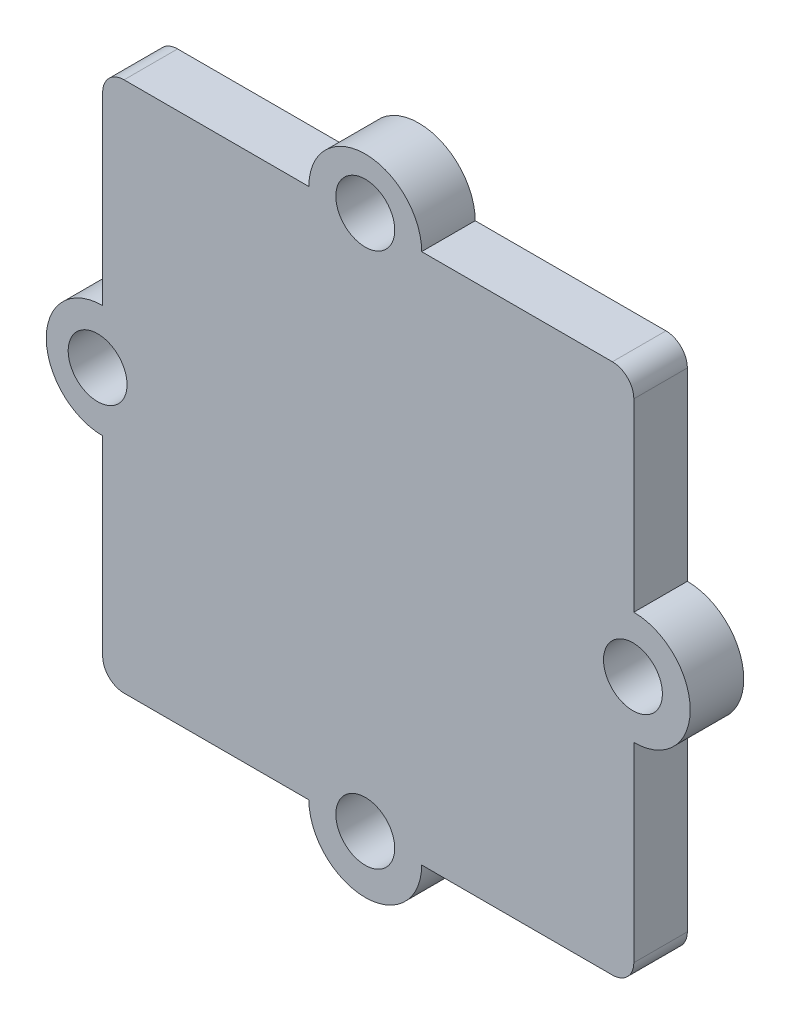
ISO-10303-21;
HEADER;
FILE_DESCRIPTION(('STEP AP214'),'2;1');
FILE_NAME('part.step','',(''),(''),'','','');
FILE_SCHEMA(('AUTOMOTIVE_DESIGN { 1 0 10303 214 1 1 1 1 }'));
ENDSEC;
DATA;
#1=APPLICATION_CONTEXT('core data for automotive mechanical design processes');
#2=APPLICATION_PROTOCOL_DEFINITION('international standard','automotive_design',2000,#1);
#3=PRODUCT_CONTEXT('',#1,'mechanical');
#4=PRODUCT('Part','Part','',(#3));
#5=PRODUCT_RELATED_PRODUCT_CATEGORY('part','',(#4));
#6=PRODUCT_DEFINITION_FORMATION('','',#4);
#7=PRODUCT_DEFINITION_CONTEXT('part definition',#1,'design');
#8=PRODUCT_DEFINITION('design','',#6,#7);
#9=PRODUCT_DEFINITION_SHAPE('','',#8);
#10=(LENGTH_UNIT() NAMED_UNIT(*) SI_UNIT(.MILLI.,.METRE.));
#11=(NAMED_UNIT(*) PLANE_ANGLE_UNIT() SI_UNIT($,.RADIAN.));
#12=(NAMED_UNIT(*) SI_UNIT($,.STERADIAN.) SOLID_ANGLE_UNIT());
#13=UNCERTAINTY_MEASURE_WITH_UNIT(LENGTH_MEASURE(1.E-05),#10,'distance_accuracy_value','');
#14=(GEOMETRIC_REPRESENTATION_CONTEXT(3) GLOBAL_UNCERTAINTY_ASSIGNED_CONTEXT((#13)) GLOBAL_UNIT_ASSIGNED_CONTEXT((#10,
#11,#12)) REPRESENTATION_CONTEXT('',''));
#15=CARTESIAN_POINT('',(0.,0.,0.));
#16=DIRECTION('',(0.,0.,1.));
#17=DIRECTION('',(1.,0.,0.));
#18=AXIS2_PLACEMENT_3D('',#15,#16,#17);
#19=CARTESIAN_POINT('',(-0.189992290307353,8.90032618677888,0.));
#20=DIRECTION('',(0.,0.,-1.));
#21=DIRECTION('',(-1.,0.,0.));
#22=AXIS2_PLACEMENT_3D('',#19,#20,#21);
#23=CYLINDRICAL_SURFACE('',#22,2.10693000000001);
#24=CARTESIAN_POINT('',(-0.189992290307353,8.90032618677888,-2.));
#25=DIRECTION('',(0.,0.,-1.));
#26=DIRECTION('',(-1.,0.,0.));
#27=AXIS2_PLACEMENT_3D('',#24,#25,#26);
#28=CIRCLE('',#27,2.10693000000001);
#29=CARTESIAN_POINT('',(-2.29692229030736,8.90032618677888,-2.));
#30=VERTEX_POINT('',#29);
#31=CARTESIAN_POINT('',(1.91693770969265,8.90032618677888,-2.));
#32=VERTEX_POINT('',#31);
#33=EDGE_CURVE('E201',#30,#32,#28,.T.);
#34=ORIENTED_EDGE('',*,*,#33,.F.);
#35=DIRECTION('',(0.,0.,-1.));
#36=VECTOR('',#35,1.);
#37=CARTESIAN_POINT('',(-2.29692229030736,8.90032618677888,0.));
#38=LINE('',#37,#36);
#39=CARTESIAN_POINT('',(-2.29692229030736,8.90032618677888,0.));
#40=VERTEX_POINT('',#39);
#41=EDGE_CURVE('E168',#40,#30,#38,.T.);
#42=ORIENTED_EDGE('',*,*,#41,.F.);
#43=CARTESIAN_POINT('',(-0.189992290307353,8.90032618677888,0.));
#44=DIRECTION('',(0.,0.,-1.));
#45=DIRECTION('',(-1.,0.,0.));
#46=AXIS2_PLACEMENT_3D('',#43,#44,#45);
#47=CIRCLE('',#46,2.10693000000001);
#48=CARTESIAN_POINT('',(1.91693770969265,8.90032618677888,0.));
#49=VERTEX_POINT('',#48);
#50=EDGE_CURVE('E163',#40,#49,#47,.T.);
#51=ORIENTED_EDGE('',*,*,#50,.T.);
#52=DIRECTION('',(0.,0.,-1.));
#53=VECTOR('',#52,1.);
#54=CARTESIAN_POINT('',(1.91693770969265,8.90032618677888,0.));
#55=LINE('',#54,#53);
#56=EDGE_CURVE('E145',#49,#32,#55,.T.);
#57=ORIENTED_EDGE('',*,*,#56,.T.);
#58=EDGE_LOOP('',(#34,#42,#51,#57));
#59=FACE_BOUND('',#58,.T.);
#60=ADVANCED_FACE('F33',(#59),#23,.T.);
#61=CARTESIAN_POINT('',(-10.0007422903073,8.90032618677888,0.));
#62=DIRECTION('',(0.,1.,0.));
#63=DIRECTION('',(-1.,0.,0.));
#64=AXIS2_PLACEMENT_3D('',#61,#62,#63);
#65=PLANE('',#64);
#66=DIRECTION('',(1.,0.,0.));
#67=VECTOR('',#66,1.);
#68=CARTESIAN_POINT('',(-10.0007422903073,8.90032618677888,-2.));
#69=LINE('',#68,#67);
#70=CARTESIAN_POINT('',(-9.20074229030731,8.90032618677888,-2.));
#71=VERTEX_POINT('',#70);
#72=EDGE_CURVE('E169',#71,#30,#69,.T.);
#73=ORIENTED_EDGE('',*,*,#72,.F.);
#74=DIRECTION('',(0.,0.,-1.));
#75=VECTOR('',#74,1.);
#76=CARTESIAN_POINT('',(-9.20074229030731,8.90032618677888,0.));
#77=LINE('',#76,#75);
#78=CARTESIAN_POINT('',(-9.20074229030731,8.90032618677888,0.));
#79=VERTEX_POINT('',#78);
#80=EDGE_CURVE('E265',#71,#79,#77,.F.);
#81=ORIENTED_EDGE('',*,*,#80,.T.);
#82=DIRECTION('',(1.,0.,0.));
#83=VECTOR('',#82,1.);
#84=CARTESIAN_POINT('',(-10.0007422903073,8.90032618677888,0.));
#85=LINE('',#84,#83);
#86=EDGE_CURVE('E157',#79,#40,#85,.T.);
#87=ORIENTED_EDGE('',*,*,#86,.T.);
#88=ORIENTED_EDGE('',*,*,#41,.T.);
#89=EDGE_LOOP('',(#73,#81,#87,#88));
#90=FACE_BOUND('',#89,.T.);
#91=ADVANCED_FACE('F277',(#90),#65,.T.);
#92=CARTESIAN_POINT('',(-10.0007422903073,1.19650618677888,0.));
#93=DIRECTION('',(-1.,0.,0.));
#94=DIRECTION('',(0.,0.,1.));
#95=AXIS2_PLACEMENT_3D('',#92,#93,#94);
#96=PLANE('',#95);
#97=DIRECTION('',(0.,1.,0.));
#98=VECTOR('',#97,1.);
#99=CARTESIAN_POINT('',(-10.0007422903073,1.19650618677888,0.));
#100=LINE('',#99,#98);
#101=CARTESIAN_POINT('',(-10.0007422903073,1.19650618677888,0.));
#102=VERTEX_POINT('',#101);
#103=CARTESIAN_POINT('',(-10.0007422903073,8.10032618677888,0.));
#104=VERTEX_POINT('',#103);
#105=EDGE_CURVE('E197',#102,#104,#100,.T.);
#106=ORIENTED_EDGE('',*,*,#105,.T.);
#107=DIRECTION('',(0.,0.,-1.));
#108=VECTOR('',#107,1.);
#109=CARTESIAN_POINT('',(-10.0007422903073,8.10032618677888,0.));
#110=LINE('',#109,#108);
#111=CARTESIAN_POINT('',(-10.0007422903073,8.10032618677888,-2.));
#112=VERTEX_POINT('',#111);
#113=EDGE_CURVE('E262',#104,#112,#110,.T.);
#114=ORIENTED_EDGE('',*,*,#113,.T.);
#115=DIRECTION('',(0.,1.,0.));
#116=VECTOR('',#115,1.);
#117=CARTESIAN_POINT('',(-10.0007422903073,1.19650618677888,-2.));
#118=LINE('',#117,#116);
#119=CARTESIAN_POINT('',(-10.0007422903073,1.19650618677888,-2.));
#120=VERTEX_POINT('',#119);
#121=EDGE_CURVE('E171',#120,#112,#118,.T.);
#122=ORIENTED_EDGE('',*,*,#121,.F.);
#123=DIRECTION('',(0.,0.,-1.));
#124=VECTOR('',#123,1.);
#125=CARTESIAN_POINT('',(-10.0007422903073,1.19650618677888,0.));
#126=LINE('',#125,#124);
#127=EDGE_CURVE('E229',#102,#120,#126,.T.);
#128=ORIENTED_EDGE('',*,*,#127,.F.);
#129=EDGE_LOOP('',(#106,#114,#122,#128));
#130=FACE_BOUND('',#129,.T.);
#131=ADVANCED_FACE('F285',(#130),#96,.T.);
#132=CARTESIAN_POINT('',(-10.0007422903073,-0.91042381322113,0.));
#133=DIRECTION('',(0.,0.,-1.));
#134=DIRECTION('',(-1.,0.,0.));
#135=AXIS2_PLACEMENT_3D('',#132,#133,#134);
#136=CYLINDRICAL_SURFACE('',#135,2.10693000000001);
#137=CARTESIAN_POINT('',(-10.0007422903073,-0.91042381322113,-2.));
#138=DIRECTION('',(0.,0.,-1.));
#139=DIRECTION('',(-1.,0.,0.));
#140=AXIS2_PLACEMENT_3D('',#137,#138,#139);
#141=CIRCLE('',#140,2.10693000000001);
#142=CARTESIAN_POINT('',(-10.0007422903073,-3.01735381322114,-2.));
#143=VERTEX_POINT('',#142);
#144=EDGE_CURVE('E222',#143,#120,#141,.T.);
#145=ORIENTED_EDGE('',*,*,#144,.F.);
#146=DIRECTION('',(0.,0.,-1.));
#147=VECTOR('',#146,1.);
#148=CARTESIAN_POINT('',(-10.0007422903073,-3.01735381322114,0.));
#149=LINE('',#148,#147);
#150=CARTESIAN_POINT('',(-10.0007422903073,-3.01735381322114,0.));
#151=VERTEX_POINT('',#150);
#152=EDGE_CURVE('E231',#151,#143,#149,.T.);
#153=ORIENTED_EDGE('',*,*,#152,.F.);
#154=CARTESIAN_POINT('',(-10.0007422903073,-0.91042381322113,0.));
#155=DIRECTION('',(0.,0.,-1.));
#156=DIRECTION('',(-1.,0.,0.));
#157=AXIS2_PLACEMENT_3D('',#154,#155,#156);
#158=CIRCLE('',#157,2.10693000000001);
#159=EDGE_CURVE('E194',#151,#102,#158,.T.);
#160=ORIENTED_EDGE('',*,*,#159,.T.);
#161=ORIENTED_EDGE('',*,*,#127,.T.);
#162=EDGE_LOOP('',(#145,#153,#160,#161));
#163=FACE_BOUND('',#162,.T.);
#164=ADVANCED_FACE('F290',(#163),#136,.T.);
#165=CARTESIAN_POINT('',(-10.0007422903073,-10.9434238132211,0.));
#166=DIRECTION('',(-1.,0.,0.));
#167=DIRECTION('',(0.,0.,1.));
#168=AXIS2_PLACEMENT_3D('',#165,#166,#167);
#169=PLANE('',#168);
#170=DIRECTION('',(0.,1.,0.));
#171=VECTOR('',#170,1.);
#172=CARTESIAN_POINT('',(-10.0007422903073,-10.9434238132211,-2.));
#173=LINE('',#172,#171);
#174=CARTESIAN_POINT('',(-10.0007422903073,-10.1434238132211,-2.));
#175=VERTEX_POINT('',#174);
#176=EDGE_CURVE('E220',#175,#143,#173,.T.);
#177=ORIENTED_EDGE('',*,*,#176,.F.);
#178=DIRECTION('',(0.,0.,-1.));
#179=VECTOR('',#178,1.);
#180=CARTESIAN_POINT('',(-10.0007422903073,-10.1434238132211,0.));
#181=LINE('',#180,#179);
#182=CARTESIAN_POINT('',(-10.0007422903073,-10.1434238132211,0.));
#183=VERTEX_POINT('',#182);
#184=EDGE_CURVE('E253',#175,#183,#181,.F.);
#185=ORIENTED_EDGE('',*,*,#184,.T.);
#186=DIRECTION('',(0.,1.,0.));
#187=VECTOR('',#186,1.);
#188=CARTESIAN_POINT('',(-10.0007422903073,-10.9434238132211,0.));
#189=LINE('',#188,#187);
#190=EDGE_CURVE('E192',#183,#151,#189,.T.);
#191=ORIENTED_EDGE('',*,*,#190,.T.);
#192=ORIENTED_EDGE('',*,*,#152,.T.);
#193=EDGE_LOOP('',(#177,#185,#191,#192));
#194=FACE_BOUND('',#193,.T.);
#195=ADVANCED_FACE('F464',(#194),#169,.T.);
#196=CARTESIAN_POINT('',(-2.29692229030736,-10.9434238132211,0.));
#197=DIRECTION('',(0.,-1.,0.));
#198=DIRECTION('',(0.,0.,-1.));
#199=AXIS2_PLACEMENT_3D('',#196,#197,#198);
#200=PLANE('',#199);
#201=DIRECTION('',(-1.,0.,0.));
#202=VECTOR('',#201,1.);
#203=CARTESIAN_POINT('',(-2.29692229030736,-10.9434238132211,0.));
#204=LINE('',#203,#202);
#205=CARTESIAN_POINT('',(-2.29692229030736,-10.9434238132211,0.));
#206=VERTEX_POINT('',#205);
#207=CARTESIAN_POINT('',(-9.20074229030731,-10.9434238132211,0.));
#208=VERTEX_POINT('',#207);
#209=EDGE_CURVE('E189',#206,#208,#204,.T.);
#210=ORIENTED_EDGE('',*,*,#209,.T.);
#211=DIRECTION('',(0.,0.,-1.));
#212=VECTOR('',#211,1.);
#213=CARTESIAN_POINT('',(-9.20074229030731,-10.9434238132211,0.));
#214=LINE('',#213,#212);
#215=CARTESIAN_POINT('',(-9.20074229030731,-10.9434238132211,-2.));
#216=VERTEX_POINT('',#215);
#217=EDGE_CURVE('E228',#208,#216,#214,.T.);
#218=ORIENTED_EDGE('',*,*,#217,.T.);
#219=DIRECTION('',(-1.,0.,0.));
#220=VECTOR('',#219,1.);
#221=CARTESIAN_POINT('',(-2.29692229030736,-10.9434238132211,-2.));
#222=LINE('',#221,#220);
#223=CARTESIAN_POINT('',(-2.29692229030736,-10.9434238132211,-2.));
#224=VERTEX_POINT('',#223);
#225=EDGE_CURVE('E217',#224,#216,#222,.T.);
#226=ORIENTED_EDGE('',*,*,#225,.F.);
#227=DIRECTION('',(0.,0.,-1.));
#228=VECTOR('',#227,1.);
#229=CARTESIAN_POINT('',(-2.29692229030736,-10.9434238132211,0.));
#230=LINE('',#229,#228);
#231=EDGE_CURVE('E234',#206,#224,#230,.T.);
#232=ORIENTED_EDGE('',*,*,#231,.F.);
#233=EDGE_LOOP('',(#210,#218,#226,#232));
#234=FACE_BOUND('',#233,.T.);
#235=ADVANCED_FACE('F301',(#234),#200,.T.);
#236=CARTESIAN_POINT('',(-0.189992290307353,-10.9434238132211,0.));
#237=DIRECTION('',(0.,0.,-1.));
#238=DIRECTION('',(-1.,0.,0.));
#239=AXIS2_PLACEMENT_3D('',#236,#237,#238);
#240=CYLINDRICAL_SURFACE('',#239,2.10693000000001);
#241=CARTESIAN_POINT('',(-0.189992290307353,-10.9434238132211,-2.));
#242=DIRECTION('',(0.,0.,-1.));
#243=DIRECTION('',(-1.,0.,0.));
#244=AXIS2_PLACEMENT_3D('',#241,#242,#243);
#245=CIRCLE('',#244,2.10693000000001);
#246=CARTESIAN_POINT('',(1.91693770969265,-10.9434238132211,-2.));
#247=VERTEX_POINT('',#246);
#248=EDGE_CURVE('E214',#247,#224,#245,.T.);
#249=ORIENTED_EDGE('',*,*,#248,.F.);
#250=DIRECTION('',(0.,0.,-1.));
#251=VECTOR('',#250,1.);
#252=CARTESIAN_POINT('',(1.91693770969265,-10.9434238132211,0.));
#253=LINE('',#252,#251);
#254=CARTESIAN_POINT('',(1.91693770969265,-10.9434238132211,0.));
#255=VERTEX_POINT('',#254);
#256=EDGE_CURVE('E236',#255,#247,#253,.T.);
#257=ORIENTED_EDGE('',*,*,#256,.F.);
#258=CARTESIAN_POINT('',(-0.189992290307353,-10.9434238132211,0.));
#259=DIRECTION('',(0.,0.,-1.));
#260=DIRECTION('',(-1.,0.,0.));
#261=AXIS2_PLACEMENT_3D('',#258,#259,#260);
#262=CIRCLE('',#261,2.10693000000001);
#263=EDGE_CURVE('E186',#255,#206,#262,.T.);
#264=ORIENTED_EDGE('',*,*,#263,.T.);
#265=ORIENTED_EDGE('',*,*,#231,.T.);
#266=EDGE_LOOP('',(#249,#257,#264,#265));
#267=FACE_BOUND('',#266,.T.);
#268=ADVANCED_FACE('F306',(#267),#240,.T.);
#269=CARTESIAN_POINT('',(9.84300770969269,-10.9434238132211,0.));
#270=DIRECTION('',(0.,-1.,0.));
#271=DIRECTION('',(0.,0.,-1.));
#272=AXIS2_PLACEMENT_3D('',#269,#270,#271);
#273=PLANE('',#272);
#274=DIRECTION('',(-1.,0.,0.));
#275=VECTOR('',#274,1.);
#276=CARTESIAN_POINT('',(9.84300770969269,-10.9434238132211,-2.));
#277=LINE('',#276,#275);
#278=CARTESIAN_POINT('',(9.04300770969269,-10.9434238132211,-2.));
#279=VERTEX_POINT('',#278);
#280=EDGE_CURVE('E212',#279,#247,#277,.T.);
#281=ORIENTED_EDGE('',*,*,#280,.F.);
#282=DIRECTION('',(0.,0.,-1.));
#283=VECTOR('',#282,1.);
#284=CARTESIAN_POINT('',(9.04300770969269,-10.9434238132211,0.));
#285=LINE('',#284,#283);
#286=CARTESIAN_POINT('',(9.04300770969269,-10.9434238132211,0.));
#287=VERTEX_POINT('',#286);
#288=EDGE_CURVE('E270',#279,#287,#285,.F.);
#289=ORIENTED_EDGE('',*,*,#288,.T.);
#290=DIRECTION('',(-1.,0.,0.));
#291=VECTOR('',#290,1.);
#292=CARTESIAN_POINT('',(9.84300770969269,-10.9434238132211,0.));
#293=LINE('',#292,#291);
#294=EDGE_CURVE('E184',#287,#255,#293,.T.);
#295=ORIENTED_EDGE('',*,*,#294,.T.);
#296=ORIENTED_EDGE('',*,*,#256,.T.);
#297=EDGE_LOOP('',(#281,#289,#295,#296));
#298=FACE_BOUND('',#297,.T.);
#299=ADVANCED_FACE('F442',(#298),#273,.T.);
#300=CARTESIAN_POINT('',(9.84300770969269,-3.01735381322114,0.));
#301=DIRECTION('',(1.,0.,0.));
#302=DIRECTION('',(0.,0.,-1.));
#303=AXIS2_PLACEMENT_3D('',#300,#301,#302);
#304=PLANE('',#303);
#305=DIRECTION('',(0.,-1.,0.));
#306=VECTOR('',#305,1.);
#307=CARTESIAN_POINT('',(9.84300770969269,-3.01735381322114,0.));
#308=LINE('',#307,#306);
#309=CARTESIAN_POINT('',(9.84300770969269,-3.01735381322114,0.));
#310=VERTEX_POINT('',#309);
#311=CARTESIAN_POINT('',(9.84300770969269,-10.1434238132211,0.));
#312=VERTEX_POINT('',#311);
#313=EDGE_CURVE('E181',#310,#312,#308,.T.);
#314=ORIENTED_EDGE('',*,*,#313,.T.);
#315=DIRECTION('',(0.,0.,-1.));
#316=VECTOR('',#315,1.);
#317=CARTESIAN_POINT('',(9.84300770969269,-10.1434238132211,0.));
#318=LINE('',#317,#316);
#319=CARTESIAN_POINT('',(9.84300770969269,-10.1434238132211,-2.));
#320=VERTEX_POINT('',#319);
#321=EDGE_CURVE('E267',#312,#320,#318,.T.);
#322=ORIENTED_EDGE('',*,*,#321,.T.);
#323=DIRECTION('',(0.,-1.,0.));
#324=VECTOR('',#323,1.);
#325=CARTESIAN_POINT('',(9.84300770969269,-3.01735381322114,-2.));
#326=LINE('',#325,#324);
#327=CARTESIAN_POINT('',(9.84300770969269,-3.01735381322114,-2.));
#328=VERTEX_POINT('',#327);
#329=EDGE_CURVE('E209',#328,#320,#326,.T.);
#330=ORIENTED_EDGE('',*,*,#329,.F.);
#331=DIRECTION('',(0.,0.,-1.));
#332=VECTOR('',#331,1.);
#333=CARTESIAN_POINT('',(9.84300770969269,-3.01735381322114,0.));
#334=LINE('',#333,#332);
#335=EDGE_CURVE('E239',#310,#328,#334,.T.);
#336=ORIENTED_EDGE('',*,*,#335,.F.);
#337=EDGE_LOOP('',(#314,#322,#330,#336));
#338=FACE_BOUND('',#337,.T.);
#339=ADVANCED_FACE('F318',(#338),#304,.T.);
#340=CARTESIAN_POINT('',(9.84300770969269,-0.91042381322113,0.));
#341=DIRECTION('',(0.,0.,-1.));
#342=DIRECTION('',(-1.,0.,0.));
#343=AXIS2_PLACEMENT_3D('',#340,#341,#342);
#344=CYLINDRICAL_SURFACE('',#343,2.10693000000001);
#345=CARTESIAN_POINT('',(9.84300770969269,-0.91042381322113,-2.));
#346=DIRECTION('',(0.,0.,-1.));
#347=DIRECTION('',(-1.,0.,0.));
#348=AXIS2_PLACEMENT_3D('',#345,#346,#347);
#349=CIRCLE('',#348,2.10693000000001);
#350=CARTESIAN_POINT('',(9.84300770969269,1.19650618677888,-2.));
#351=VERTEX_POINT('',#350);
#352=EDGE_CURVE('E206',#351,#328,#349,.T.);
#353=ORIENTED_EDGE('',*,*,#352,.F.);
#354=DIRECTION('',(0.,0.,-1.));
#355=VECTOR('',#354,1.);
#356=CARTESIAN_POINT('',(9.84300770969269,1.19650618677888,0.));
#357=LINE('',#356,#355);
#358=CARTESIAN_POINT('',(9.84300770969269,1.19650618677888,0.));
#359=VERTEX_POINT('',#358);
#360=EDGE_CURVE('E156',#359,#351,#357,.T.);
#361=ORIENTED_EDGE('',*,*,#360,.F.);
#362=CARTESIAN_POINT('',(9.84300770969269,-0.91042381322113,0.));
#363=DIRECTION('',(0.,0.,-1.));
#364=DIRECTION('',(-1.,0.,0.));
#365=AXIS2_PLACEMENT_3D('',#362,#363,#364);
#366=CIRCLE('',#365,2.10693000000001);
#367=EDGE_CURVE('E178',#359,#310,#366,.T.);
#368=ORIENTED_EDGE('',*,*,#367,.T.);
#369=ORIENTED_EDGE('',*,*,#335,.T.);
#370=EDGE_LOOP('',(#353,#361,#368,#369));
#371=FACE_BOUND('',#370,.T.);
#372=ADVANCED_FACE('F322',(#371),#344,.T.);
#373=CARTESIAN_POINT('',(9.84300770969269,8.90032618677888,0.));
#374=DIRECTION('',(1.,0.,0.));
#375=DIRECTION('',(0.,1.,0.));
#376=AXIS2_PLACEMENT_3D('',#373,#374,#375);
#377=PLANE('',#376);
#378=DIRECTION('',(0.,-1.,0.));
#379=VECTOR('',#378,1.);
#380=CARTESIAN_POINT('',(9.84300770969269,8.90032618677888,-2.));
#381=LINE('',#380,#379);
#382=CARTESIAN_POINT('',(9.84300770969269,8.10032618677888,-2.));
#383=VERTEX_POINT('',#382);
#384=EDGE_CURVE('E204',#383,#351,#381,.T.);
#385=ORIENTED_EDGE('',*,*,#384,.F.);
#386=DIRECTION('',(0.,0.,-1.));
#387=VECTOR('',#386,1.);
#388=CARTESIAN_POINT('',(9.84300770969269,8.10032618677888,0.));
#389=LINE('',#388,#387);
#390=CARTESIAN_POINT('',(9.84300770969269,8.10032618677888,0.));
#391=VERTEX_POINT('',#390);
#392=EDGE_CURVE('E11',#383,#391,#389,.F.);
#393=ORIENTED_EDGE('',*,*,#392,.T.);
#394=DIRECTION('',(0.,-1.,0.));
#395=VECTOR('',#394,1.);
#396=CARTESIAN_POINT('',(9.84300770969269,8.90032618677888,0.));
#397=LINE('',#396,#395);
#398=EDGE_CURVE('E164',#391,#359,#397,.T.);
#399=ORIENTED_EDGE('',*,*,#398,.T.);
#400=ORIENTED_EDGE('',*,*,#360,.T.);
#401=EDGE_LOOP('',(#385,#393,#399,#400));
#402=FACE_BOUND('',#401,.T.);
#403=ADVANCED_FACE('F422',(#402),#377,.T.);
#404=CARTESIAN_POINT('',(1.91693770969265,8.90032618677888,0.));
#405=DIRECTION('',(0.,1.,0.));
#406=DIRECTION('',(-1.,0.,0.));
#407=AXIS2_PLACEMENT_3D('',#404,#405,#406);
#408=PLANE('',#407);
#409=DIRECTION('',(1.,0.,0.));
#410=VECTOR('',#409,1.);
#411=CARTESIAN_POINT('',(1.91693770969265,8.90032618677888,0.));
#412=LINE('',#411,#410);
#413=CARTESIAN_POINT('',(9.04300770969269,8.90032618677888,0.));
#414=VERTEX_POINT('',#413);
#415=EDGE_CURVE('E148',#49,#414,#412,.T.);
#416=ORIENTED_EDGE('',*,*,#415,.T.);
#417=DIRECTION('',(0.,0.,-1.));
#418=VECTOR('',#417,1.);
#419=CARTESIAN_POINT('',(9.04300770969269,8.90032618677888,0.));
#420=LINE('',#419,#418);
#421=CARTESIAN_POINT('',(9.04300770969269,8.90032618677888,-2.));
#422=VERTEX_POINT('',#421);
#423=EDGE_CURVE('E41',#414,#422,#420,.T.);
#424=ORIENTED_EDGE('',*,*,#423,.T.);
#425=DIRECTION('',(1.,0.,0.));
#426=VECTOR('',#425,1.);
#427=CARTESIAN_POINT('',(1.91693770969265,8.90032618677888,-2.));
#428=LINE('',#427,#426);
#429=EDGE_CURVE('E151',#32,#422,#428,.T.);
#430=ORIENTED_EDGE('',*,*,#429,.F.);
#431=ORIENTED_EDGE('',*,*,#56,.F.);
#432=EDGE_LOOP('',(#416,#424,#430,#431));
#433=FACE_BOUND('',#432,.T.);
#434=ADVANCED_FACE('F146',(#433),#408,.T.);
#435=CARTESIAN_POINT('',(-0.189992290307353,8.90032618677888,0.));
#436=DIRECTION('',(0.,0.,-1.));
#437=DIRECTION('',(-1.,0.,0.));
#438=AXIS2_PLACEMENT_3D('',#435,#436,#437);
#439=PLANE('',#438);
#440=CARTESIAN_POINT('',(-0.189367377960084,-10.9074292965425,0.));
#441=DIRECTION('',(0.,0.,-1.));
#442=DIRECTION('',(-1.,0.,0.));
#443=AXIS2_PLACEMENT_3D('',#440,#441,#442);
#444=CIRCLE('',#443,1.10000034);
#445=CARTESIAN_POINT('',(-1.28936771796008,-10.9074292965425,0.));
#446=VERTEX_POINT('',#445);
#447=EDGE_CURVE('E514',#446,#446,#444,.T.);
#448=ORIENTED_EDGE('',*,*,#447,.T.);
#449=EDGE_LOOP('',(#448));
#450=FACE_BOUND('',#449,.T.);
#451=CARTESIAN_POINT('',(-0.189367377960084,9.09257070345745,0.));
#452=DIRECTION('',(0.,0.,-1.));
#453=DIRECTION('',(-1.,0.,0.));
#454=AXIS2_PLACEMENT_3D('',#451,#452,#453);
#455=CIRCLE('',#454,1.10000034);
#456=CARTESIAN_POINT('',(-1.28936771796008,9.09257070345745,0.));
#457=VERTEX_POINT('',#456);
#458=EDGE_CURVE('E518',#457,#457,#455,.T.);
#459=ORIENTED_EDGE('',*,*,#458,.T.);
#460=EDGE_LOOP('',(#459));
#461=FACE_BOUND('',#460,.T.);
#462=CARTESIAN_POINT('',(-10.1893673779601,-0.907429296542537,0.));
#463=DIRECTION('',(0.,0.,-1.));
#464=DIRECTION('',(-1.,0.,0.));
#465=AXIS2_PLACEMENT_3D('',#462,#463,#464);
#466=CIRCLE('',#465,1.10000034);
#467=CARTESIAN_POINT('',(-11.2893677179601,-0.907429296542537,0.));
#468=VERTEX_POINT('',#467);
#469=EDGE_CURVE('E522',#468,#468,#466,.T.);
#470=ORIENTED_EDGE('',*,*,#469,.T.);
#471=EDGE_LOOP('',(#470));
#472=FACE_BOUND('',#471,.T.);
#473=CARTESIAN_POINT('',(9.81063262203993,-0.907429296542537,0.));
#474=DIRECTION('',(0.,0.,-1.));
#475=DIRECTION('',(-1.,0.,0.));
#476=AXIS2_PLACEMENT_3D('',#473,#474,#475);
#477=CIRCLE('',#476,1.10000034);
#478=CARTESIAN_POINT('',(8.71063228203993,-0.907429296542537,0.));
#479=VERTEX_POINT('',#478);
#480=EDGE_CURVE('E174',#479,#479,#477,.T.);
#481=ORIENTED_EDGE('',*,*,#480,.T.);
#482=EDGE_LOOP('',(#481));
#483=FACE_BOUND('',#482,.T.);
#484=ORIENTED_EDGE('',*,*,#190,.F.);
#485=CARTESIAN_POINT('',(-9.20074229030731,-10.1434238132211,0.));
#486=DIRECTION('',(0.,0.,-1.));
#487=DIRECTION('',(-1.,0.,0.));
#488=AXIS2_PLACEMENT_3D('',#485,#486,#487);
#489=CIRCLE('',#488,0.799999999999998);
#490=EDGE_CURVE('E260',#183,#208,#489,.F.);
#491=ORIENTED_EDGE('',*,*,#490,.T.);
#492=ORIENTED_EDGE('',*,*,#209,.F.);
#493=ORIENTED_EDGE('',*,*,#263,.F.);
#494=ORIENTED_EDGE('',*,*,#294,.F.);
#495=CARTESIAN_POINT('',(9.04300770969269,-10.1434238132211,0.));
#496=DIRECTION('',(0.,0.,-1.));
#497=DIRECTION('',(-1.,0.,0.));
#498=AXIS2_PLACEMENT_3D('',#495,#496,#497);
#499=CIRCLE('',#498,0.799999999999998);
#500=EDGE_CURVE('E256',#287,#312,#499,.F.);
#501=ORIENTED_EDGE('',*,*,#500,.T.);
#502=ORIENTED_EDGE('',*,*,#313,.F.);
#503=ORIENTED_EDGE('',*,*,#367,.F.);
#504=ORIENTED_EDGE('',*,*,#398,.F.);
#505=CARTESIAN_POINT('',(9.04300770969269,8.10032618677888,0.));
#506=DIRECTION('',(0.,0.,-1.));
#507=DIRECTION('',(-1.,0.,0.));
#508=AXIS2_PLACEMENT_3D('',#505,#506,#507);
#509=CIRCLE('',#508,0.799999999999998);
#510=EDGE_CURVE('E48',#391,#414,#509,.F.);
#511=ORIENTED_EDGE('',*,*,#510,.T.);
#512=ORIENTED_EDGE('',*,*,#415,.F.);
#513=ORIENTED_EDGE('',*,*,#50,.F.);
#514=ORIENTED_EDGE('',*,*,#86,.F.);
#515=CARTESIAN_POINT('',(-9.20074229030731,8.10032618677888,0.));
#516=DIRECTION('',(0.,0.,-1.));
#517=DIRECTION('',(-1.,0.,0.));
#518=AXIS2_PLACEMENT_3D('',#515,#516,#517);
#519=CIRCLE('',#518,0.799999999999998);
#520=EDGE_CURVE('E258',#79,#104,#519,.F.);
#521=ORIENTED_EDGE('',*,*,#520,.T.);
#522=ORIENTED_EDGE('',*,*,#105,.F.);
#523=ORIENTED_EDGE('',*,*,#159,.F.);
#524=EDGE_LOOP('',(#484,#491,#492,#493,#494,#501,#502,#503,#504,#511,#512,#513,#514,#521,#522,#523));
#525=FACE_BOUND('',#524,.T.);
#526=ADVANCED_FACE('F161',(#450,#461,#472,#483,#525),#439,.F.);
#527=CARTESIAN_POINT('',(-0.189992290307353,8.90032618677888,-2.));
#528=DIRECTION('',(0.,0.,-1.));
#529=DIRECTION('',(-1.,0.,0.));
#530=AXIS2_PLACEMENT_3D('',#527,#528,#529);
#531=PLANE('',#530);
#532=CARTESIAN_POINT('',(-0.189367377960084,-10.9074292965425,-2.));
#533=DIRECTION('',(0.,0.,-1.));
#534=DIRECTION('',(-1.,0.,0.));
#535=AXIS2_PLACEMENT_3D('',#532,#533,#534);
#536=CIRCLE('',#535,1.10000034);
#537=CARTESIAN_POINT('',(-1.28936771796008,-10.9074292965425,-2.));
#538=VERTEX_POINT('',#537);
#539=EDGE_CURVE('E539',#538,#538,#536,.T.);
#540=ORIENTED_EDGE('',*,*,#539,.F.);
#541=EDGE_LOOP('',(#540));
#542=FACE_BOUND('',#541,.T.);
#543=CARTESIAN_POINT('',(-0.189367377960084,9.09257070345745,-2.));
#544=DIRECTION('',(0.,0.,-1.));
#545=DIRECTION('',(-1.,0.,0.));
#546=AXIS2_PLACEMENT_3D('',#543,#544,#545);
#547=CIRCLE('',#546,1.10000034);
#548=CARTESIAN_POINT('',(-1.28936771796008,9.09257070345745,-2.));
#549=VERTEX_POINT('',#548);
#550=EDGE_CURVE('E535',#549,#549,#547,.T.);
#551=ORIENTED_EDGE('',*,*,#550,.F.);
#552=EDGE_LOOP('',(#551));
#553=FACE_BOUND('',#552,.T.);
#554=CARTESIAN_POINT('',(-10.1893673779601,-0.907429296542537,-2.));
#555=DIRECTION('',(0.,0.,-1.));
#556=DIRECTION('',(-1.,0.,0.));
#557=AXIS2_PLACEMENT_3D('',#554,#555,#556);
#558=CIRCLE('',#557,1.10000034);
#559=CARTESIAN_POINT('',(-11.2893677179601,-0.907429296542537,-2.));
#560=VERTEX_POINT('',#559);
#561=EDGE_CURVE('E529',#560,#560,#558,.T.);
#562=ORIENTED_EDGE('',*,*,#561,.F.);
#563=EDGE_LOOP('',(#562));
#564=FACE_BOUND('',#563,.T.);
#565=CARTESIAN_POINT('',(9.81063262203993,-0.907429296542537,-2.));
#566=DIRECTION('',(0.,0.,-1.));
#567=DIRECTION('',(-1.,0.,0.));
#568=AXIS2_PLACEMENT_3D('',#565,#566,#567);
#569=CIRCLE('',#568,1.10000034);
#570=CARTESIAN_POINT('',(8.71063228203993,-0.907429296542537,-2.));
#571=VERTEX_POINT('',#570);
#572=EDGE_CURVE('E525',#571,#571,#569,.T.);
#573=ORIENTED_EDGE('',*,*,#572,.F.);
#574=EDGE_LOOP('',(#573));
#575=FACE_BOUND('',#574,.T.);
#576=ORIENTED_EDGE('',*,*,#225,.T.);
#577=CARTESIAN_POINT('',(-9.20074229030731,-10.1434238132211,-2.));
#578=DIRECTION('',(0.,0.,-1.));
#579=DIRECTION('',(-1.,0.,0.));
#580=AXIS2_PLACEMENT_3D('',#577,#578,#579);
#581=CIRCLE('',#580,0.799999999999998);
#582=EDGE_CURVE('E251',#216,#175,#581,.T.);
#583=ORIENTED_EDGE('',*,*,#582,.T.);
#584=ORIENTED_EDGE('',*,*,#176,.T.);
#585=ORIENTED_EDGE('',*,*,#144,.T.);
#586=ORIENTED_EDGE('',*,*,#121,.T.);
#587=CARTESIAN_POINT('',(-9.20074229030731,8.10032618677888,-2.));
#588=DIRECTION('',(0.,0.,-1.));
#589=DIRECTION('',(-1.,0.,0.));
#590=AXIS2_PLACEMENT_3D('',#587,#588,#589);
#591=CIRCLE('',#590,0.799999999999998);
#592=EDGE_CURVE('E249',#112,#71,#591,.T.);
#593=ORIENTED_EDGE('',*,*,#592,.T.);
#594=ORIENTED_EDGE('',*,*,#72,.T.);
#595=ORIENTED_EDGE('',*,*,#33,.T.);
#596=ORIENTED_EDGE('',*,*,#429,.T.);
#597=CARTESIAN_POINT('',(9.04300770969269,8.10032618677888,-2.));
#598=DIRECTION('',(0.,0.,-1.));
#599=DIRECTION('',(-1.,0.,0.));
#600=AXIS2_PLACEMENT_3D('',#597,#598,#599);
#601=CIRCLE('',#600,0.799999999999998);
#602=EDGE_CURVE('E245',#422,#383,#601,.T.);
#603=ORIENTED_EDGE('',*,*,#602,.T.);
#604=ORIENTED_EDGE('',*,*,#384,.T.);
#605=ORIENTED_EDGE('',*,*,#352,.T.);
#606=ORIENTED_EDGE('',*,*,#329,.T.);
#607=CARTESIAN_POINT('',(9.04300770969269,-10.1434238132211,-2.));
#608=DIRECTION('',(0.,0.,-1.));
#609=DIRECTION('',(-1.,0.,0.));
#610=AXIS2_PLACEMENT_3D('',#607,#608,#609);
#611=CIRCLE('',#610,0.799999999999998);
#612=EDGE_CURVE('E247',#320,#279,#611,.T.);
#613=ORIENTED_EDGE('',*,*,#612,.T.);
#614=ORIENTED_EDGE('',*,*,#280,.T.);
#615=ORIENTED_EDGE('',*,*,#248,.T.);
#616=EDGE_LOOP('',(#576,#583,#584,#585,#586,#593,#594,#595,#596,#603,#604,#605,#606,#613,#614,#615));
#617=FACE_BOUND('',#616,.T.);
#618=ADVANCED_FACE('F273',(#542,#553,#564,#575,#617),#531,.T.);
#619=CARTESIAN_POINT('',(9.81063262203993,-0.907429296542537,-2.));
#620=DIRECTION('',(0.,0.,-1.));
#621=DIRECTION('',(-1.,0.,0.));
#622=AXIS2_PLACEMENT_3D('',#619,#620,#621);
#623=CYLINDRICAL_SURFACE('',#622,1.10000034);
#624=ORIENTED_EDGE('',*,*,#480,.F.);
#625=EDGE_LOOP('',(#624));
#626=FACE_BOUND('',#625,.T.);
#627=ORIENTED_EDGE('',*,*,#572,.T.);
#628=EDGE_LOOP('',(#627));
#629=FACE_BOUND('',#628,.T.);
#630=ADVANCED_FACE('F389',(#626,#629),#623,.F.);
#631=CARTESIAN_POINT('',(-10.1893673779601,-0.907429296542537,-2.));
#632=DIRECTION('',(0.,0.,-1.));
#633=DIRECTION('',(-1.,0.,0.));
#634=AXIS2_PLACEMENT_3D('',#631,#632,#633);
#635=CYLINDRICAL_SURFACE('',#634,1.10000034);
#636=ORIENTED_EDGE('',*,*,#469,.F.);
#637=EDGE_LOOP('',(#636));
#638=FACE_BOUND('',#637,.T.);
#639=ORIENTED_EDGE('',*,*,#561,.T.);
#640=EDGE_LOOP('',(#639));
#641=FACE_BOUND('',#640,.T.);
#642=ADVANCED_FACE('F380',(#638,#641),#635,.F.);
#643=CARTESIAN_POINT('',(-0.189367377960084,9.09257070345745,-2.));
#644=DIRECTION('',(0.,0.,-1.));
#645=DIRECTION('',(-1.,0.,0.));
#646=AXIS2_PLACEMENT_3D('',#643,#644,#645);
#647=CYLINDRICAL_SURFACE('',#646,1.10000034);
#648=ORIENTED_EDGE('',*,*,#458,.F.);
#649=EDGE_LOOP('',(#648));
#650=FACE_BOUND('',#649,.T.);
#651=ORIENTED_EDGE('',*,*,#550,.T.);
#652=EDGE_LOOP('',(#651));
#653=FACE_BOUND('',#652,.T.);
#654=ADVANCED_FACE('F370',(#650,#653),#647,.F.);
#655=CARTESIAN_POINT('',(-0.189367377960084,-10.9074292965425,-2.));
#656=DIRECTION('',(0.,0.,-1.));
#657=DIRECTION('',(-1.,0.,0.));
#658=AXIS2_PLACEMENT_3D('',#655,#656,#657);
#659=CYLINDRICAL_SURFACE('',#658,1.10000034);
#660=ORIENTED_EDGE('',*,*,#447,.F.);
#661=EDGE_LOOP('',(#660));
#662=FACE_BOUND('',#661,.T.);
#663=ORIENTED_EDGE('',*,*,#539,.T.);
#664=EDGE_LOOP('',(#663));
#665=FACE_BOUND('',#664,.T.);
#666=ADVANCED_FACE('F339',(#662,#665),#659,.F.);
#667=CARTESIAN_POINT('',(-9.20074229030731,-10.1434238132211,0.));
#668=DIRECTION('',(0.,0.,-1.));
#669=DIRECTION('',(-1.,0.,0.));
#670=AXIS2_PLACEMENT_3D('',#667,#668,#669);
#671=CYLINDRICAL_SURFACE('',#670,0.799999999999998);
#672=ORIENTED_EDGE('',*,*,#490,.F.);
#673=ORIENTED_EDGE('',*,*,#184,.F.);
#674=ORIENTED_EDGE('',*,*,#582,.F.);
#675=ORIENTED_EDGE('',*,*,#217,.F.);
#676=EDGE_LOOP('',(#672,#673,#674,#675));
#677=FACE_BOUND('',#676,.T.);
#678=ADVANCED_FACE('F298',(#677),#671,.T.);
#679=CARTESIAN_POINT('',(-9.20074229030731,8.10032618677888,0.));
#680=DIRECTION('',(0.,0.,-1.));
#681=DIRECTION('',(-1.,0.,0.));
#682=AXIS2_PLACEMENT_3D('',#679,#680,#681);
#683=CYLINDRICAL_SURFACE('',#682,0.799999999999998);
#684=ORIENTED_EDGE('',*,*,#520,.F.);
#685=ORIENTED_EDGE('',*,*,#80,.F.);
#686=ORIENTED_EDGE('',*,*,#592,.F.);
#687=ORIENTED_EDGE('',*,*,#113,.F.);
#688=EDGE_LOOP('',(#684,#685,#686,#687));
#689=FACE_BOUND('',#688,.T.);
#690=ADVANCED_FACE('F282',(#689),#683,.T.);
#691=CARTESIAN_POINT('',(9.04300770969269,-10.1434238132211,0.));
#692=DIRECTION('',(0.,0.,-1.));
#693=DIRECTION('',(-1.,0.,0.));
#694=AXIS2_PLACEMENT_3D('',#691,#692,#693);
#695=CYLINDRICAL_SURFACE('',#694,0.799999999999998);
#696=ORIENTED_EDGE('',*,*,#500,.F.);
#697=ORIENTED_EDGE('',*,*,#288,.F.);
#698=ORIENTED_EDGE('',*,*,#612,.F.);
#699=ORIENTED_EDGE('',*,*,#321,.F.);
#700=EDGE_LOOP('',(#696,#697,#698,#699));
#701=FACE_BOUND('',#700,.T.);
#702=ADVANCED_FACE('F315',(#701),#695,.T.);
#703=CARTESIAN_POINT('',(9.04300770969269,8.10032618677888,0.));
#704=DIRECTION('',(0.,0.,-1.));
#705=DIRECTION('',(-1.,0.,0.));
#706=AXIS2_PLACEMENT_3D('',#703,#704,#705);
#707=CYLINDRICAL_SURFACE('',#706,0.799999999999998);
#708=ORIENTED_EDGE('',*,*,#510,.F.);
#709=ORIENTED_EDGE('',*,*,#392,.F.);
#710=ORIENTED_EDGE('',*,*,#602,.F.);
#711=ORIENTED_EDGE('',*,*,#423,.F.);
#712=EDGE_LOOP('',(#708,#709,#710,#711));
#713=FACE_BOUND('',#712,.T.);
#714=ADVANCED_FACE('F35',(#713),#707,.T.);
#715=CLOSED_SHELL('',(#60,#91,#131,#164,#195,#235,#268,#299,#339,#372,#403,#434,#526,#618,#630,
#642,#654,#666,#678,#690,#702,#714));
#716=MANIFOLD_SOLID_BREP('B2',#715);
#717=ADVANCED_BREP_SHAPE_REPRESENTATION('',(#18,#716),#14);
#718=SHAPE_DEFINITION_REPRESENTATION(#9,#717);
ENDSEC;
END-ISO-10303-21;
